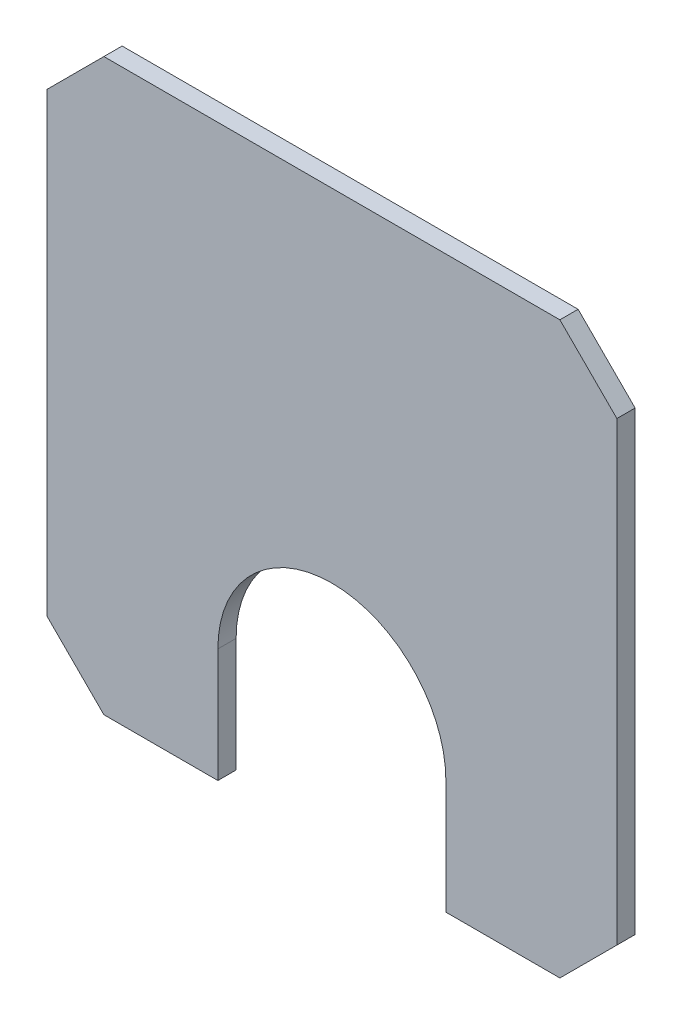
ISO-10303-21;
HEADER;
FILE_DESCRIPTION(('STEP AP214'),'2;1');
FILE_NAME('part.step','',(''),(''),'','','');
FILE_SCHEMA(('AUTOMOTIVE_DESIGN { 1 0 10303 214 1 1 1 1 }'));
ENDSEC;
DATA;
#1=APPLICATION_CONTEXT('core data for automotive mechanical design processes');
#2=APPLICATION_PROTOCOL_DEFINITION('international standard','automotive_design',2000,#1);
#3=PRODUCT_CONTEXT('',#1,'mechanical');
#4=PRODUCT('Part','Part','',(#3));
#5=PRODUCT_RELATED_PRODUCT_CATEGORY('part','',(#4));
#6=PRODUCT_DEFINITION_FORMATION('','',#4);
#7=PRODUCT_DEFINITION_CONTEXT('part definition',#1,'design');
#8=PRODUCT_DEFINITION('design','',#6,#7);
#9=PRODUCT_DEFINITION_SHAPE('','',#8);
#10=(LENGTH_UNIT() NAMED_UNIT(*) SI_UNIT(.MILLI.,.METRE.));
#11=(NAMED_UNIT(*) PLANE_ANGLE_UNIT() SI_UNIT($,.RADIAN.));
#12=(NAMED_UNIT(*) SI_UNIT($,.STERADIAN.) SOLID_ANGLE_UNIT());
#13=UNCERTAINTY_MEASURE_WITH_UNIT(LENGTH_MEASURE(1.E-05),#10,'distance_accuracy_value','');
#14=(GEOMETRIC_REPRESENTATION_CONTEXT(3) GLOBAL_UNCERTAINTY_ASSIGNED_CONTEXT((#13)) GLOBAL_UNIT_ASSIGNED_CONTEXT((#10,
#11,#12)) REPRESENTATION_CONTEXT('',''));
#15=CARTESIAN_POINT('',(0.,0.,0.));
#16=DIRECTION('',(0.,0.,1.));
#17=DIRECTION('',(1.,0.,0.));
#18=AXIS2_PLACEMENT_3D('',#15,#16,#17);
#19=CARTESIAN_POINT('',(24.99999699,9.99999778,1.59999934));
#20=DIRECTION('',(0.,0.,-1.));
#21=DIRECTION('',(-1.,0.,0.));
#22=AXIS2_PLACEMENT_3D('',#19,#20,#21);
#23=CYLINDRICAL_SURFACE('',#22,9.99999905);
#24=CARTESIAN_POINT('',(24.99999699,9.99999778,0.));
#25=DIRECTION('',(0.,0.,-1.));
#26=DIRECTION('',(1.,0.,0.));
#27=AXIS2_PLACEMENT_3D('',#24,#25,#26);
#28=CIRCLE('',#27,9.99999905);
#29=CARTESIAN_POINT('',(14.99999794,9.99999778,0.));
#30=VERTEX_POINT('',#29);
#31=CARTESIAN_POINT('',(34.99999604,9.99999778,0.));
#32=VERTEX_POINT('',#31);
#33=EDGE_CURVE('E155',#30,#32,#28,.T.);
#34=ORIENTED_EDGE('',*,*,#33,.T.);
#35=DIRECTION('',(0.,0.,-1.));
#36=VECTOR('',#35,1.);
#37=CARTESIAN_POINT('',(34.99999604,9.99999778,1.59999934));
#38=LINE('',#37,#36);
#39=CARTESIAN_POINT('',(34.99999604,9.99999778,1.59999934));
#40=VERTEX_POINT('',#39);
#41=EDGE_CURVE('E11',#40,#32,#38,.T.);
#42=ORIENTED_EDGE('',*,*,#41,.F.);
#43=CARTESIAN_POINT('',(24.99999699,9.99999778,1.59999934));
#44=DIRECTION('',(0.,0.,-1.));
#45=DIRECTION('',(1.,0.,0.));
#46=AXIS2_PLACEMENT_3D('',#43,#44,#45);
#47=CIRCLE('',#46,9.99999905);
#48=CARTESIAN_POINT('',(14.99999794,9.99999778,1.59999934));
#49=VERTEX_POINT('',#48);
#50=EDGE_CURVE('E177',#49,#40,#47,.T.);
#51=ORIENTED_EDGE('',*,*,#50,.F.);
#52=DIRECTION('',(0.,0.,-1.));
#53=VECTOR('',#52,1.);
#54=CARTESIAN_POINT('',(14.99999794,9.99999778,1.59999934));
#55=LINE('',#54,#53);
#56=EDGE_CURVE('E151',#49,#30,#55,.T.);
#57=ORIENTED_EDGE('',*,*,#56,.T.);
#58=EDGE_LOOP('',(#34,#42,#51,#57));
#59=FACE_BOUND('',#58,.T.);
#60=ADVANCED_FACE('F35',(#59),#23,.F.);
#61=CARTESIAN_POINT('',(34.99999858,0.,1.59999934));
#62=DIRECTION('',(0.999999999999968,2.54000055893487E-07,0.));
#63=DIRECTION('',(-2.54000055893487E-07,0.999999999999968,0.));
#64=AXIS2_PLACEMENT_3D('',#61,#62,#63);
#65=PLANE('',#64);
#66=DIRECTION('',(2.54000055893487E-07,-0.999999999999968,0.));
#67=VECTOR('',#66,1.);
#68=CARTESIAN_POINT('',(34.99999858,0.,0.));
#69=LINE('',#68,#67);
#70=CARTESIAN_POINT('',(34.99999858,0.,0.));
#71=VERTEX_POINT('',#70);
#72=EDGE_CURVE('E158',#32,#71,#69,.T.);
#73=ORIENTED_EDGE('',*,*,#72,.T.);
#74=DIRECTION('',(0.,0.,-1.));
#75=VECTOR('',#74,1.);
#76=CARTESIAN_POINT('',(34.99999858,0.,1.59999934));
#77=LINE('',#76,#75);
#78=CARTESIAN_POINT('',(34.99999858,0.,1.59999934));
#79=VERTEX_POINT('',#78);
#80=EDGE_CURVE('E43',#79,#71,#77,.T.);
#81=ORIENTED_EDGE('',*,*,#80,.F.);
#82=DIRECTION('',(2.54000055893487E-07,-0.999999999999968,0.));
#83=VECTOR('',#82,1.);
#84=CARTESIAN_POINT('',(34.99999858,0.,1.59999934));
#85=LINE('',#84,#83);
#86=EDGE_CURVE('E106',#40,#79,#85,.T.);
#87=ORIENTED_EDGE('',*,*,#86,.F.);
#88=ORIENTED_EDGE('',*,*,#41,.T.);
#89=EDGE_LOOP('',(#73,#81,#87,#88));
#90=FACE_BOUND('',#89,.T.);
#91=ADVANCED_FACE('F255',(#90),#65,.F.);
#92=CARTESIAN_POINT('',(44.9999989,0.,1.59999934));
#93=DIRECTION('',(0.,1.,0.));
#94=DIRECTION('',(0.,0.,1.));
#95=AXIS2_PLACEMENT_3D('',#92,#93,#94);
#96=PLANE('',#95);
#97=DIRECTION('',(1.,0.,0.));
#98=VECTOR('',#97,1.);
#99=CARTESIAN_POINT('',(44.9999989,0.,0.));
#100=LINE('',#99,#98);
#101=CARTESIAN_POINT('',(44.9999989,0.,0.));
#102=VERTEX_POINT('',#101);
#103=EDGE_CURVE('E160',#71,#102,#100,.T.);
#104=ORIENTED_EDGE('',*,*,#103,.T.);
#105=DIRECTION('',(0.,0.,-1.));
#106=VECTOR('',#105,1.);
#107=CARTESIAN_POINT('',(44.9999989,0.,1.59999934));
#108=LINE('',#107,#106);
#109=CARTESIAN_POINT('',(44.9999989,0.,1.59999934));
#110=VERTEX_POINT('',#109);
#111=EDGE_CURVE('E196',#110,#102,#108,.T.);
#112=ORIENTED_EDGE('',*,*,#111,.F.);
#113=DIRECTION('',(1.,0.,0.));
#114=VECTOR('',#113,1.);
#115=CARTESIAN_POINT('',(44.9999989,0.,1.59999934));
#116=LINE('',#115,#114);
#117=EDGE_CURVE('E204',#79,#110,#116,.T.);
#118=ORIENTED_EDGE('',*,*,#117,.F.);
#119=ORIENTED_EDGE('',*,*,#80,.T.);
#120=EDGE_LOOP('',(#104,#112,#118,#119));
#121=FACE_BOUND('',#120,.T.);
#122=ADVANCED_FACE('F202',(#121),#96,.F.);
#123=CARTESIAN_POINT('',(49.99999906,4.99999762,1.59999934));
#124=DIRECTION('',(-0.707106601581363,0.707106960791686,0.));
#125=DIRECTION('',(-0.707106960791686,-0.707106601581363,0.));
#126=AXIS2_PLACEMENT_3D('',#123,#124,#125);
#127=PLANE('',#126);
#128=DIRECTION('',(0.707106960791686,0.707106601581363,0.));
#129=VECTOR('',#128,1.);
#130=CARTESIAN_POINT('',(49.99999906,4.99999762,0.));
#131=LINE('',#130,#129);
#132=CARTESIAN_POINT('',(49.99999906,4.99999762,0.));
#133=VERTEX_POINT('',#132);
#134=EDGE_CURVE('E162',#102,#133,#131,.T.);
#135=ORIENTED_EDGE('',*,*,#134,.T.);
#136=DIRECTION('',(0.,0.,-1.));
#137=VECTOR('',#136,1.);
#138=CARTESIAN_POINT('',(49.99999906,4.99999762,1.59999934));
#139=LINE('',#138,#137);
#140=CARTESIAN_POINT('',(49.99999906,4.99999762,1.59999934));
#141=VERTEX_POINT('',#140);
#142=EDGE_CURVE('E193',#141,#133,#139,.T.);
#143=ORIENTED_EDGE('',*,*,#142,.F.);
#144=DIRECTION('',(0.707106960791686,0.707106601581363,0.));
#145=VECTOR('',#144,1.);
#146=CARTESIAN_POINT('',(49.99999906,4.99999762,1.59999934));
#147=LINE('',#146,#145);
#148=EDGE_CURVE('E222',#110,#141,#147,.T.);
#149=ORIENTED_EDGE('',*,*,#148,.F.);
#150=ORIENTED_EDGE('',*,*,#111,.T.);
#151=EDGE_LOOP('',(#135,#143,#149,#150));
#152=FACE_BOUND('',#151,.T.);
#153=ADVANCED_FACE('F213',(#152),#127,.F.);
#154=CARTESIAN_POINT('',(49.99999906,44.9999989,1.59999934));
#155=DIRECTION('',(-1.,0.,0.));
#156=DIRECTION('',(0.,0.,1.));
#157=AXIS2_PLACEMENT_3D('',#154,#155,#156);
#158=PLANE('',#157);
#159=DIRECTION('',(0.,1.,0.));
#160=VECTOR('',#159,1.);
#161=CARTESIAN_POINT('',(49.99999906,44.9999989,0.));
#162=LINE('',#161,#160);
#163=CARTESIAN_POINT('',(49.99999906,44.9999989,0.));
#164=VERTEX_POINT('',#163);
#165=EDGE_CURVE('E164',#133,#164,#162,.T.);
#166=ORIENTED_EDGE('',*,*,#165,.T.);
#167=DIRECTION('',(0.,0.,-1.));
#168=VECTOR('',#167,1.);
#169=CARTESIAN_POINT('',(49.99999906,44.9999989,1.59999934));
#170=LINE('',#169,#168);
#171=CARTESIAN_POINT('',(49.99999906,44.9999989,1.59999934));
#172=VERTEX_POINT('',#171);
#173=EDGE_CURVE('E190',#172,#164,#170,.T.);
#174=ORIENTED_EDGE('',*,*,#173,.F.);
#175=DIRECTION('',(0.,1.,0.));
#176=VECTOR('',#175,1.);
#177=CARTESIAN_POINT('',(49.99999906,44.9999989,1.59999934));
#178=LINE('',#177,#176);
#179=EDGE_CURVE('E219',#141,#172,#178,.T.);
#180=ORIENTED_EDGE('',*,*,#179,.F.);
#181=ORIENTED_EDGE('',*,*,#142,.T.);
#182=EDGE_LOOP('',(#166,#174,#180,#181));
#183=FACE_BOUND('',#182,.T.);
#184=ADVANCED_FACE('F217',(#183),#158,.F.);
#185=CARTESIAN_POINT('',(44.9999989,49.99999906,1.59999934));
#186=DIRECTION('',(-0.707106781186547,-0.707106781186547,0.));
#187=DIRECTION('',(0.707106781186548,-0.707106781186548,0.));
#188=AXIS2_PLACEMENT_3D('',#185,#186,#187);
#189=PLANE('',#188);
#190=DIRECTION('',(-0.707106781186547,0.707106781186547,0.));
#191=VECTOR('',#190,1.);
#192=CARTESIAN_POINT('',(44.9999989,49.99999906,0.));
#193=LINE('',#192,#191);
#194=CARTESIAN_POINT('',(44.9999989,49.99999906,0.));
#195=VERTEX_POINT('',#194);
#196=EDGE_CURVE('E166',#164,#195,#193,.T.);
#197=ORIENTED_EDGE('',*,*,#196,.T.);
#198=DIRECTION('',(0.,0.,-1.));
#199=VECTOR('',#198,1.);
#200=CARTESIAN_POINT('',(44.9999989,49.99999906,1.59999934));
#201=LINE('',#200,#199);
#202=CARTESIAN_POINT('',(44.9999989,49.99999906,1.59999934));
#203=VERTEX_POINT('',#202);
#204=EDGE_CURVE('E187',#203,#195,#201,.T.);
#205=ORIENTED_EDGE('',*,*,#204,.F.);
#206=DIRECTION('',(-0.707106781186547,0.707106781186547,0.));
#207=VECTOR('',#206,1.);
#208=CARTESIAN_POINT('',(44.9999989,49.99999906,1.59999934));
#209=LINE('',#208,#207);
#210=EDGE_CURVE('E221',#172,#203,#209,.T.);
#211=ORIENTED_EDGE('',*,*,#210,.F.);
#212=ORIENTED_EDGE('',*,*,#173,.T.);
#213=EDGE_LOOP('',(#197,#205,#211,#212));
#214=FACE_BOUND('',#213,.T.);
#215=ADVANCED_FACE('F268',(#214),#189,.F.);
#216=CARTESIAN_POINT('',(4.99999762,49.99999906,1.59999934));
#217=DIRECTION('',(0.,-1.,0.));
#218=DIRECTION('',(0.,0.,-1.));
#219=AXIS2_PLACEMENT_3D('',#216,#217,#218);
#220=PLANE('',#219);
#221=DIRECTION('',(-1.,0.,0.));
#222=VECTOR('',#221,1.);
#223=CARTESIAN_POINT('',(4.99999762,49.99999906,0.));
#224=LINE('',#223,#222);
#225=CARTESIAN_POINT('',(4.99999762,49.99999906,0.));
#226=VERTEX_POINT('',#225);
#227=EDGE_CURVE('E168',#195,#226,#224,.T.);
#228=ORIENTED_EDGE('',*,*,#227,.T.);
#229=DIRECTION('',(0.,0.,-1.));
#230=VECTOR('',#229,1.);
#231=CARTESIAN_POINT('',(4.99999762,49.99999906,1.59999934));
#232=LINE('',#231,#230);
#233=CARTESIAN_POINT('',(4.99999762,49.99999906,1.59999934));
#234=VERTEX_POINT('',#233);
#235=EDGE_CURVE('E184',#234,#226,#232,.T.);
#236=ORIENTED_EDGE('',*,*,#235,.F.);
#237=DIRECTION('',(-1.,0.,0.));
#238=VECTOR('',#237,1.);
#239=CARTESIAN_POINT('',(4.99999762,49.99999906,1.59999934));
#240=LINE('',#239,#238);
#241=EDGE_CURVE('E224',#203,#234,#240,.T.);
#242=ORIENTED_EDGE('',*,*,#241,.F.);
#243=ORIENTED_EDGE('',*,*,#204,.T.);
#244=EDGE_LOOP('',(#228,#236,#242,#243));
#245=FACE_BOUND('',#244,.T.);
#246=ADVANCED_FACE('F271',(#245),#220,.F.);
#247=CARTESIAN_POINT('',(0.,44.9999989,1.59999934));
#248=DIRECTION('',(0.707106960791686,-0.707106601581363,0.));
#249=DIRECTION('',(0.707106601581363,0.707106960791686,0.));
#250=AXIS2_PLACEMENT_3D('',#247,#248,#249);
#251=PLANE('',#250);
#252=DIRECTION('',(-0.707106601581363,-0.707106960791686,0.));
#253=VECTOR('',#252,1.);
#254=CARTESIAN_POINT('',(0.,44.9999989,0.));
#255=LINE('',#254,#253);
#256=CARTESIAN_POINT('',(0.,44.9999989,0.));
#257=VERTEX_POINT('',#256);
#258=EDGE_CURVE('E170',#226,#257,#255,.T.);
#259=ORIENTED_EDGE('',*,*,#258,.T.);
#260=DIRECTION('',(0.,0.,-1.));
#261=VECTOR('',#260,1.);
#262=CARTESIAN_POINT('',(0.,44.9999989,1.59999934));
#263=LINE('',#262,#261);
#264=CARTESIAN_POINT('',(0.,44.9999989,1.59999934));
#265=VERTEX_POINT('',#264);
#266=EDGE_CURVE('E181',#265,#257,#263,.T.);
#267=ORIENTED_EDGE('',*,*,#266,.F.);
#268=DIRECTION('',(-0.707106601581363,-0.707106960791686,0.));
#269=VECTOR('',#268,1.);
#270=CARTESIAN_POINT('',(0.,44.9999989,1.59999934));
#271=LINE('',#270,#269);
#272=EDGE_CURVE('E230',#234,#265,#271,.T.);
#273=ORIENTED_EDGE('',*,*,#272,.F.);
#274=ORIENTED_EDGE('',*,*,#235,.T.);
#275=EDGE_LOOP('',(#259,#267,#273,#274));
#276=FACE_BOUND('',#275,.T.);
#277=ADVANCED_FACE('F236',(#276),#251,.F.);
#278=CARTESIAN_POINT('',(0.,4.99999762,1.59999934));
#279=DIRECTION('',(1.,0.,0.));
#280=DIRECTION('',(0.,0.,-1.));
#281=AXIS2_PLACEMENT_3D('',#278,#279,#280);
#282=PLANE('',#281);
#283=DIRECTION('',(0.,-1.,0.));
#284=VECTOR('',#283,1.);
#285=CARTESIAN_POINT('',(0.,4.99999762,0.));
#286=LINE('',#285,#284);
#287=CARTESIAN_POINT('',(0.,4.99999762,0.));
#288=VERTEX_POINT('',#287);
#289=EDGE_CURVE('E172',#257,#288,#286,.T.);
#290=ORIENTED_EDGE('',*,*,#289,.T.);
#291=DIRECTION('',(0.,0.,-1.));
#292=VECTOR('',#291,1.);
#293=CARTESIAN_POINT('',(0.,4.99999762,1.59999934));
#294=LINE('',#293,#292);
#295=CARTESIAN_POINT('',(0.,4.99999762,1.59999934));
#296=VERTEX_POINT('',#295);
#297=EDGE_CURVE('E146',#296,#288,#294,.T.);
#298=ORIENTED_EDGE('',*,*,#297,.F.);
#299=DIRECTION('',(0.,-1.,0.));
#300=VECTOR('',#299,1.);
#301=CARTESIAN_POINT('',(0.,4.99999762,1.59999934));
#302=LINE('',#301,#300);
#303=EDGE_CURVE('E137',#265,#296,#302,.T.);
#304=ORIENTED_EDGE('',*,*,#303,.F.);
#305=ORIENTED_EDGE('',*,*,#266,.T.);
#306=EDGE_LOOP('',(#290,#298,#304,#305));
#307=FACE_BOUND('',#306,.T.);
#308=ADVANCED_FACE('F240',(#307),#282,.F.);
#309=CARTESIAN_POINT('',(4.99999762,0.,1.59999934));
#310=DIRECTION('',(0.707106781186547,0.707106781186547,0.));
#311=DIRECTION('',(-0.707106781186548,0.707106781186548,0.));
#312=AXIS2_PLACEMENT_3D('',#309,#310,#311);
#313=PLANE('',#312);
#314=DIRECTION('',(0.707106781186547,-0.707106781186547,0.));
#315=VECTOR('',#314,1.);
#316=CARTESIAN_POINT('',(4.99999762,0.,0.));
#317=LINE('',#316,#315);
#318=CARTESIAN_POINT('',(4.99999762,0.,0.));
#319=VERTEX_POINT('',#318);
#320=EDGE_CURVE('E145',#288,#319,#317,.T.);
#321=ORIENTED_EDGE('',*,*,#320,.T.);
#322=DIRECTION('',(0.,0.,-1.));
#323=VECTOR('',#322,1.);
#324=CARTESIAN_POINT('',(4.99999762,0.,1.59999934));
#325=LINE('',#324,#323);
#326=CARTESIAN_POINT('',(4.99999762,0.,1.59999934));
#327=VERTEX_POINT('',#326);
#328=EDGE_CURVE('E142',#327,#319,#325,.T.);
#329=ORIENTED_EDGE('',*,*,#328,.F.);
#330=DIRECTION('',(0.707106781186547,-0.707106781186547,0.));
#331=VECTOR('',#330,1.);
#332=CARTESIAN_POINT('',(4.99999762,0.,1.59999934));
#333=LINE('',#332,#331);
#334=EDGE_CURVE('E131',#296,#327,#333,.T.);
#335=ORIENTED_EDGE('',*,*,#334,.F.);
#336=ORIENTED_EDGE('',*,*,#297,.T.);
#337=EDGE_LOOP('',(#321,#329,#335,#336));
#338=FACE_BOUND('',#337,.T.);
#339=ADVANCED_FACE('F143',(#338),#313,.F.);
#340=CARTESIAN_POINT('',(14.99999794,0.,1.59999934));
#341=DIRECTION('',(0.,1.,0.));
#342=DIRECTION('',(0.,0.,1.));
#343=AXIS2_PLACEMENT_3D('',#340,#341,#342);
#344=PLANE('',#343);
#345=DIRECTION('',(1.,0.,0.));
#346=VECTOR('',#345,1.);
#347=CARTESIAN_POINT('',(14.99999794,0.,0.));
#348=LINE('',#347,#346);
#349=CARTESIAN_POINT('',(14.99999794,0.,0.));
#350=VERTEX_POINT('',#349);
#351=EDGE_CURVE('E92',#319,#350,#348,.T.);
#352=ORIENTED_EDGE('',*,*,#351,.T.);
#353=DIRECTION('',(0.,0.,-1.));
#354=VECTOR('',#353,1.);
#355=CARTESIAN_POINT('',(14.99999794,0.,1.59999934));
#356=LINE('',#355,#354);
#357=CARTESIAN_POINT('',(14.99999794,0.,1.59999934));
#358=VERTEX_POINT('',#357);
#359=EDGE_CURVE('E147',#358,#350,#356,.T.);
#360=ORIENTED_EDGE('',*,*,#359,.F.);
#361=DIRECTION('',(1.,0.,0.));
#362=VECTOR('',#361,1.);
#363=CARTESIAN_POINT('',(14.99999794,0.,1.59999934));
#364=LINE('',#363,#362);
#365=EDGE_CURVE('E135',#327,#358,#364,.T.);
#366=ORIENTED_EDGE('',*,*,#365,.F.);
#367=ORIENTED_EDGE('',*,*,#328,.T.);
#368=EDGE_LOOP('',(#352,#360,#366,#367));
#369=FACE_BOUND('',#368,.T.);
#370=ADVANCED_FACE('F149',(#369),#344,.F.);
#371=CARTESIAN_POINT('',(14.99999794,9.99999778,1.59999934));
#372=DIRECTION('',(-1.,0.,0.));
#373=DIRECTION('',(0.,0.,1.));
#374=AXIS2_PLACEMENT_3D('',#371,#372,#373);
#375=PLANE('',#374);
#376=DIRECTION('',(0.,1.,0.));
#377=VECTOR('',#376,1.);
#378=CARTESIAN_POINT('',(14.99999794,9.99999778,0.));
#379=LINE('',#378,#377);
#380=EDGE_CURVE('E98',#350,#30,#379,.T.);
#381=ORIENTED_EDGE('',*,*,#380,.T.);
#382=ORIENTED_EDGE('',*,*,#56,.F.);
#383=DIRECTION('',(0.,1.,0.));
#384=VECTOR('',#383,1.);
#385=CARTESIAN_POINT('',(14.99999794,9.99999778,1.59999934));
#386=LINE('',#385,#384);
#387=EDGE_CURVE('E51',#358,#49,#386,.T.);
#388=ORIENTED_EDGE('',*,*,#387,.F.);
#389=ORIENTED_EDGE('',*,*,#359,.T.);
#390=EDGE_LOOP('',(#381,#382,#388,#389));
#391=FACE_BOUND('',#390,.T.);
#392=ADVANCED_FACE('F244',(#391),#375,.F.);
#393=CARTESIAN_POINT('',(24.99999699,9.99999778,1.59999934));
#394=DIRECTION('',(0.,0.,1.));
#395=DIRECTION('',(1.,0.,0.));
#396=AXIS2_PLACEMENT_3D('',#393,#394,#395);
#397=PLANE('',#396);
#398=ORIENTED_EDGE('',*,*,#50,.T.);
#399=ORIENTED_EDGE('',*,*,#86,.T.);
#400=ORIENTED_EDGE('',*,*,#117,.T.);
#401=ORIENTED_EDGE('',*,*,#148,.T.);
#402=ORIENTED_EDGE('',*,*,#179,.T.);
#403=ORIENTED_EDGE('',*,*,#210,.T.);
#404=ORIENTED_EDGE('',*,*,#241,.T.);
#405=ORIENTED_EDGE('',*,*,#272,.T.);
#406=ORIENTED_EDGE('',*,*,#303,.T.);
#407=ORIENTED_EDGE('',*,*,#334,.T.);
#408=ORIENTED_EDGE('',*,*,#365,.T.);
#409=ORIENTED_EDGE('',*,*,#387,.T.);
#410=EDGE_LOOP('',(#398,#399,#400,#401,#402,#403,#404,#405,#406,#407,#408,#409));
#411=FACE_BOUND('',#410,.T.);
#412=ADVANCED_FACE('F133',(#411),#397,.T.);
#413=CARTESIAN_POINT('',(24.99999699,9.99999778,0.));
#414=DIRECTION('',(0.,0.,1.));
#415=DIRECTION('',(1.,0.,0.));
#416=AXIS2_PLACEMENT_3D('',#413,#414,#415);
#417=PLANE('',#416);
#418=ORIENTED_EDGE('',*,*,#33,.F.);
#419=ORIENTED_EDGE('',*,*,#380,.F.);
#420=ORIENTED_EDGE('',*,*,#351,.F.);
#421=ORIENTED_EDGE('',*,*,#320,.F.);
#422=ORIENTED_EDGE('',*,*,#289,.F.);
#423=ORIENTED_EDGE('',*,*,#258,.F.);
#424=ORIENTED_EDGE('',*,*,#227,.F.);
#425=ORIENTED_EDGE('',*,*,#196,.F.);
#426=ORIENTED_EDGE('',*,*,#165,.F.);
#427=ORIENTED_EDGE('',*,*,#134,.F.);
#428=ORIENTED_EDGE('',*,*,#103,.F.);
#429=ORIENTED_EDGE('',*,*,#72,.F.);
#430=EDGE_LOOP('',(#418,#419,#420,#421,#422,#423,#424,#425,#426,#427,#428,#429));
#431=FACE_BOUND('',#430,.T.);
#432=ADVANCED_FACE('F208',(#431),#417,.F.);
#433=CLOSED_SHELL('',(#60,#91,#122,#153,#184,#215,#246,#277,#308,#339,#370,#392,#412,#432));
#434=MANIFOLD_SOLID_BREP('B2',#433);
#435=ADVANCED_BREP_SHAPE_REPRESENTATION('',(#18,#434),#14);
#436=SHAPE_DEFINITION_REPRESENTATION(#9,#435);
ENDSEC;
END-ISO-10303-21;
